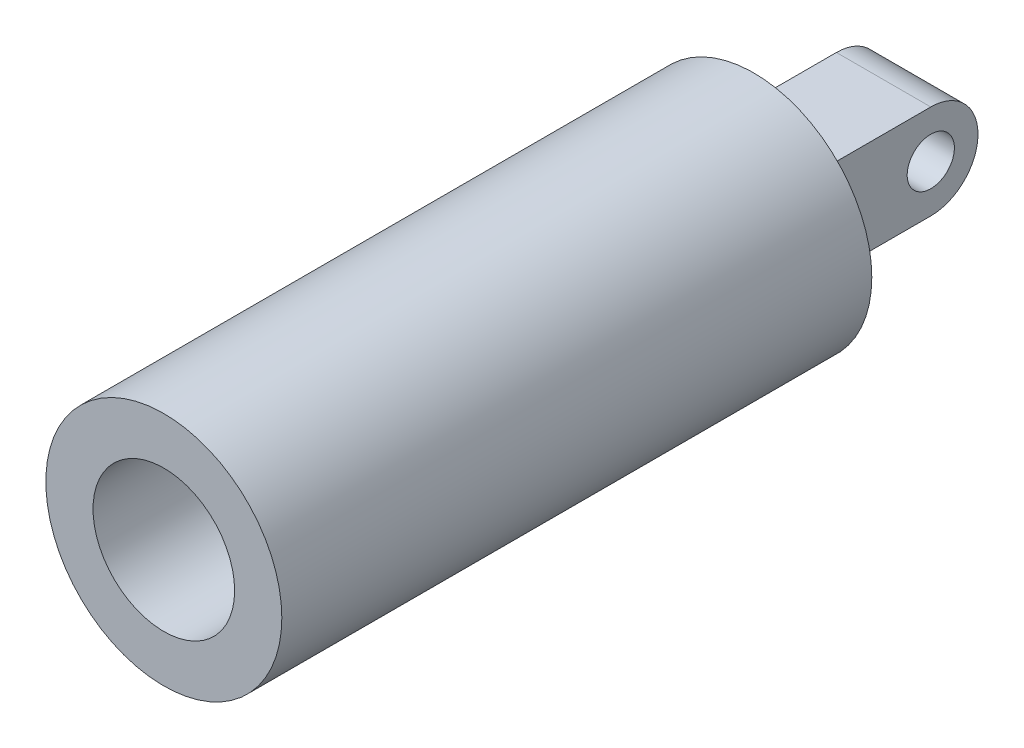
ISO-10303-21;
HEADER;
FILE_DESCRIPTION(('STEP AP214'),'2;1');
FILE_NAME('part.step','',(''),(''),'','','');
FILE_SCHEMA(('AUTOMOTIVE_DESIGN { 1 0 10303 214 1 1 1 1 }'));
ENDSEC;
DATA;
#1=APPLICATION_CONTEXT('core data for automotive mechanical design processes');
#2=APPLICATION_PROTOCOL_DEFINITION('international standard','automotive_design',2000,#1);
#3=PRODUCT_CONTEXT('',#1,'mechanical');
#4=PRODUCT('Part','Part','',(#3));
#5=PRODUCT_RELATED_PRODUCT_CATEGORY('part','',(#4));
#6=PRODUCT_DEFINITION_FORMATION('','',#4);
#7=PRODUCT_DEFINITION_CONTEXT('part definition',#1,'design');
#8=PRODUCT_DEFINITION('design','',#6,#7);
#9=PRODUCT_DEFINITION_SHAPE('','',#8);
#10=(LENGTH_UNIT() NAMED_UNIT(*) SI_UNIT(.MILLI.,.METRE.));
#11=(NAMED_UNIT(*) PLANE_ANGLE_UNIT() SI_UNIT($,.RADIAN.));
#12=(NAMED_UNIT(*) SI_UNIT($,.STERADIAN.) SOLID_ANGLE_UNIT());
#13=UNCERTAINTY_MEASURE_WITH_UNIT(LENGTH_MEASURE(1.E-05),#10,'distance_accuracy_value','');
#14=(GEOMETRIC_REPRESENTATION_CONTEXT(3) GLOBAL_UNCERTAINTY_ASSIGNED_CONTEXT((#13)) GLOBAL_UNIT_ASSIGNED_CONTEXT((#10,
#11,#12)) REPRESENTATION_CONTEXT('',''));
#15=CARTESIAN_POINT('',(0.,0.,0.));
#16=DIRECTION('',(0.,0.,1.));
#17=DIRECTION('',(1.,0.,0.));
#18=AXIS2_PLACEMENT_3D('',#15,#16,#17);
#19=CARTESIAN_POINT('',(0.,0.,0.));
#20=DIRECTION('',(0.,0.,1.));
#21=DIRECTION('',(1.,0.,0.));
#22=AXIS2_PLACEMENT_3D('',#19,#20,#21);
#23=PLANE('',#22);
#24=DIRECTION('',(1.,0.,0.));
#25=VECTOR('',#24,1.);
#26=CARTESIAN_POINT('',(-4.,5.,0.));
#27=LINE('',#26,#25);
#28=CARTESIAN_POINT('',(5.,5.,0.));
#29=VERTEX_POINT('',#28);
#30=CARTESIAN_POINT('',(-5.,5.,0.));
#31=VERTEX_POINT('',#30);
#32=EDGE_CURVE('E140',#29,#31,#27,.F.);
#33=ORIENTED_EDGE('',*,*,#32,.T.);
#34=DIRECTION('',(0.,1.,0.));
#35=VECTOR('',#34,1.);
#36=CARTESIAN_POINT('',(-5.,-4.,0.));
#37=LINE('',#36,#35);
#38=CARTESIAN_POINT('',(-5.,-5.,0.));
#39=VERTEX_POINT('',#38);
#40=EDGE_CURVE('E146',#31,#39,#37,.F.);
#41=ORIENTED_EDGE('',*,*,#40,.T.);
#42=DIRECTION('',(-1.,0.,0.));
#43=VECTOR('',#42,1.);
#44=CARTESIAN_POINT('',(4.,-5.,0.));
#45=LINE('',#44,#43);
#46=CARTESIAN_POINT('',(5.,-5.,0.));
#47=VERTEX_POINT('',#46);
#48=EDGE_CURVE('E144',#39,#47,#45,.F.);
#49=ORIENTED_EDGE('',*,*,#48,.T.);
#50=DIRECTION('',(0.,-1.,0.));
#51=VECTOR('',#50,1.);
#52=CARTESIAN_POINT('',(5.,4.,0.));
#53=LINE('',#52,#51);
#54=EDGE_CURVE('E142',#47,#29,#53,.F.);
#55=ORIENTED_EDGE('',*,*,#54,.T.);
#56=EDGE_LOOP('',(#33,#41,#49,#55));
#57=FACE_BOUND('',#56,.T.);
#58=CARTESIAN_POINT('',(0.,0.,0.));
#59=DIRECTION('',(0.,0.,1.));
#60=DIRECTION('',(1.,0.,0.));
#61=AXIS2_PLACEMENT_3D('',#58,#59,#60);
#62=CIRCLE('',#61,10.);
#63=CARTESIAN_POINT('',(10.,0.,0.));
#64=VERTEX_POINT('',#63);
#65=EDGE_CURVE('E128',#64,#64,#62,.T.);
#66=ORIENTED_EDGE('',*,*,#65,.F.);
#67=EDGE_LOOP('',(#66));
#68=FACE_BOUND('',#67,.T.);
#69=ADVANCED_FACE('F39',(#57,#68),#23,.F.);
#70=CARTESIAN_POINT('',(0.,0.,50.));
#71=DIRECTION('',(0.,0.,-1.));
#72=DIRECTION('',(-1.,0.,0.));
#73=AXIS2_PLACEMENT_3D('',#70,#71,#72);
#74=CYLINDRICAL_SURFACE('',#73,10.);
#75=CARTESIAN_POINT('',(0.,0.,50.));
#76=DIRECTION('',(0.,0.,1.));
#77=DIRECTION('',(1.,0.,0.));
#78=AXIS2_PLACEMENT_3D('',#75,#76,#77);
#79=CIRCLE('',#78,10.);
#80=CARTESIAN_POINT('',(10.,0.,50.));
#81=VERTEX_POINT('',#80);
#82=EDGE_CURVE('E123',#81,#81,#79,.T.);
#83=ORIENTED_EDGE('',*,*,#82,.F.);
#84=EDGE_LOOP('',(#83));
#85=FACE_BOUND('',#84,.T.);
#86=ORIENTED_EDGE('',*,*,#65,.T.);
#87=EDGE_LOOP('',(#86));
#88=FACE_BOUND('',#87,.T.);
#89=ADVANCED_FACE('F187',(#85,#88),#74,.T.);
#90=CARTESIAN_POINT('',(0.,0.,50.));
#91=DIRECTION('',(0.,0.,1.));
#92=DIRECTION('',(1.,0.,0.));
#93=AXIS2_PLACEMENT_3D('',#90,#91,#92);
#94=PLANE('',#93);
#95=CARTESIAN_POINT('',(0.,0.,50.));
#96=DIRECTION('',(0.,0.,1.));
#97=DIRECTION('',(1.,0.,0.));
#98=AXIS2_PLACEMENT_3D('',#95,#96,#97);
#99=CIRCLE('',#98,6.);
#100=CARTESIAN_POINT('',(6.,0.,50.));
#101=VERTEX_POINT('',#100);
#102=EDGE_CURVE('E116',#101,#101,#99,.T.);
#103=ORIENTED_EDGE('',*,*,#102,.F.);
#104=EDGE_LOOP('',(#103));
#105=FACE_BOUND('',#104,.T.);
#106=ORIENTED_EDGE('',*,*,#82,.T.);
#107=EDGE_LOOP('',(#106));
#108=FACE_BOUND('',#107,.T.);
#109=ADVANCED_FACE('F193',(#105,#108),#94,.T.);
#110=CARTESIAN_POINT('',(0.,0.,4.));
#111=DIRECTION('',(0.,0.,1.));
#112=DIRECTION('',(1.,0.,0.));
#113=AXIS2_PLACEMENT_3D('',#110,#111,#112);
#114=CYLINDRICAL_SURFACE('',#113,6.);
#115=CARTESIAN_POINT('',(0.,0.,4.));
#116=DIRECTION('',(0.,0.,1.));
#117=DIRECTION('',(1.,0.,0.));
#118=AXIS2_PLACEMENT_3D('',#115,#116,#117);
#119=CIRCLE('',#118,6.);
#120=CARTESIAN_POINT('',(6.,0.,4.));
#121=VERTEX_POINT('',#120);
#122=EDGE_CURVE('E239',#121,#121,#119,.T.);
#123=ORIENTED_EDGE('',*,*,#122,.F.);
#124=EDGE_LOOP('',(#123));
#125=FACE_BOUND('',#124,.T.);
#126=ORIENTED_EDGE('',*,*,#102,.T.);
#127=EDGE_LOOP('',(#126));
#128=FACE_BOUND('',#127,.T.);
#129=ADVANCED_FACE('F227',(#125,#128),#114,.F.);
#130=CARTESIAN_POINT('',(0.,0.,4.));
#131=DIRECTION('',(0.,0.,1.));
#132=DIRECTION('',(1.,0.,0.));
#133=AXIS2_PLACEMENT_3D('',#130,#131,#132);
#134=PLANE('',#133);
#135=ORIENTED_EDGE('',*,*,#122,.T.);
#136=EDGE_LOOP('',(#135));
#137=FACE_BOUND('',#136,.T.);
#138=ADVANCED_FACE('F224',(#137),#134,.T.);
#139=CARTESIAN_POINT('',(-4.,-4.,-15.));
#140=DIRECTION('',(1.,0.,0.));
#141=DIRECTION('',(0.,0.,-1.));
#142=AXIS2_PLACEMENT_3D('',#139,#140,#141);
#143=PLANE('',#142);
#144=CARTESIAN_POINT('',(-4.,0.,-11.));
#145=DIRECTION('',(1.,0.,0.));
#146=DIRECTION('',(0.,0.,-1.));
#147=AXIS2_PLACEMENT_3D('',#144,#145,#146);
#148=CIRCLE('',#147,2.);
#149=CARTESIAN_POINT('',(-4.,0.,-13.));
#150=VERTEX_POINT('',#149);
#151=EDGE_CURVE('E155',#150,#150,#148,.F.);
#152=ORIENTED_EDGE('',*,*,#151,.F.);
#153=EDGE_LOOP('',(#152));
#154=FACE_BOUND('',#153,.T.);
#155=DIRECTION('',(0.,0.,1.));
#156=VECTOR('',#155,1.);
#157=CARTESIAN_POINT('',(-4.,-4.,-15.));
#158=LINE('',#157,#156);
#159=CARTESIAN_POINT('',(-4.,-4.,-11.));
#160=VERTEX_POINT('',#159);
#161=CARTESIAN_POINT('',(-4.,-4.,-1.));
#162=VERTEX_POINT('',#161);
#163=EDGE_CURVE('E138',#160,#162,#158,.T.);
#164=ORIENTED_EDGE('',*,*,#163,.T.);
#165=DIRECTION('',(0.,1.,0.));
#166=VECTOR('',#165,1.);
#167=CARTESIAN_POINT('',(-4.,4.,-1.));
#168=LINE('',#167,#166);
#169=CARTESIAN_POINT('',(-4.,4.,-1.));
#170=VERTEX_POINT('',#169);
#171=EDGE_CURVE('E106',#162,#170,#168,.T.);
#172=ORIENTED_EDGE('',*,*,#171,.T.);
#173=DIRECTION('',(0.,0.,1.));
#174=VECTOR('',#173,1.);
#175=CARTESIAN_POINT('',(-4.,4.,-15.));
#176=LINE('',#175,#174);
#177=CARTESIAN_POINT('',(-4.,4.,-11.));
#178=VERTEX_POINT('',#177);
#179=EDGE_CURVE('E101',#178,#170,#176,.T.);
#180=ORIENTED_EDGE('',*,*,#179,.F.);
#181=CARTESIAN_POINT('',(-4.,0.,-11.));
#182=DIRECTION('',(1.,0.,0.));
#183=DIRECTION('',(0.,0.,-1.));
#184=AXIS2_PLACEMENT_3D('',#181,#182,#183);
#185=CIRCLE('',#184,4.);
#186=CARTESIAN_POINT('',(-4.,0.,-15.));
#187=VERTEX_POINT('',#186);
#188=EDGE_CURVE('E113',#178,#187,#185,.F.);
#189=ORIENTED_EDGE('',*,*,#188,.T.);
#190=CARTESIAN_POINT('',(-4.,0.,-11.));
#191=DIRECTION('',(1.,0.,0.));
#192=DIRECTION('',(0.,0.,-1.));
#193=AXIS2_PLACEMENT_3D('',#190,#191,#192);
#194=CIRCLE('',#193,4.);
#195=EDGE_CURVE('E122',#187,#160,#194,.F.);
#196=ORIENTED_EDGE('',*,*,#195,.T.);
#197=EDGE_LOOP('',(#164,#172,#180,#189,#196));
#198=FACE_BOUND('',#197,.T.);
#199=ADVANCED_FACE('F112',(#154,#198),#143,.F.);
#200=CARTESIAN_POINT('',(4.,4.,-15.));
#201=DIRECTION('',(0.,-1.,0.));
#202=DIRECTION('',(0.,0.,-1.));
#203=AXIS2_PLACEMENT_3D('',#200,#201,#202);
#204=PLANE('',#203);
#205=ORIENTED_EDGE('',*,*,#179,.T.);
#206=DIRECTION('',(1.,0.,0.));
#207=VECTOR('',#206,1.);
#208=CARTESIAN_POINT('',(4.,4.,-1.));
#209=LINE('',#208,#207);
#210=CARTESIAN_POINT('',(4.,4.,-1.));
#211=VERTEX_POINT('',#210);
#212=EDGE_CURVE('E11',#170,#211,#209,.T.);
#213=ORIENTED_EDGE('',*,*,#212,.T.);
#214=DIRECTION('',(0.,0.,1.));
#215=VECTOR('',#214,1.);
#216=CARTESIAN_POINT('',(4.,4.,-15.));
#217=LINE('',#216,#215);
#218=CARTESIAN_POINT('',(4.,4.,-11.));
#219=VERTEX_POINT('',#218);
#220=EDGE_CURVE('E102',#219,#211,#217,.T.);
#221=ORIENTED_EDGE('',*,*,#220,.F.);
#222=DIRECTION('',(1.,0.,0.));
#223=VECTOR('',#222,1.);
#224=CARTESIAN_POINT('',(4.,4.,-11.));
#225=LINE('',#224,#223);
#226=EDGE_CURVE('E98',#219,#178,#225,.F.);
#227=ORIENTED_EDGE('',*,*,#226,.T.);
#228=EDGE_LOOP('',(#205,#213,#221,#227));
#229=FACE_BOUND('',#228,.T.);
#230=ADVANCED_FACE('F100',(#229),#204,.F.);
#231=CARTESIAN_POINT('',(4.,-4.,-15.));
#232=DIRECTION('',(-1.,0.,0.));
#233=DIRECTION('',(0.,0.,1.));
#234=AXIS2_PLACEMENT_3D('',#231,#232,#233);
#235=PLANE('',#234);
#236=CARTESIAN_POINT('',(4.,0.,-11.));
#237=DIRECTION('',(1.,0.,0.));
#238=DIRECTION('',(0.,0.,-1.));
#239=AXIS2_PLACEMENT_3D('',#236,#237,#238);
#240=CIRCLE('',#239,2.);
#241=CARTESIAN_POINT('',(4.,0.,-13.));
#242=VERTEX_POINT('',#241);
#243=EDGE_CURVE('E251',#242,#242,#240,.T.);
#244=ORIENTED_EDGE('',*,*,#243,.F.);
#245=EDGE_LOOP('',(#244));
#246=FACE_BOUND('',#245,.T.);
#247=ORIENTED_EDGE('',*,*,#220,.T.);
#248=DIRECTION('',(0.,-1.,0.));
#249=VECTOR('',#248,1.);
#250=CARTESIAN_POINT('',(4.,-4.,-1.));
#251=LINE('',#250,#249);
#252=CARTESIAN_POINT('',(4.,-4.,-1.));
#253=VERTEX_POINT('',#252);
#254=EDGE_CURVE('E48',#211,#253,#251,.T.);
#255=ORIENTED_EDGE('',*,*,#254,.T.);
#256=DIRECTION('',(0.,0.,1.));
#257=VECTOR('',#256,1.);
#258=CARTESIAN_POINT('',(4.,-4.,-15.));
#259=LINE('',#258,#257);
#260=CARTESIAN_POINT('',(4.,-4.,-11.));
#261=VERTEX_POINT('',#260);
#262=EDGE_CURVE('E246',#261,#253,#259,.T.);
#263=ORIENTED_EDGE('',*,*,#262,.F.);
#264=CARTESIAN_POINT('',(4.,0.,-11.));
#265=DIRECTION('',(-1.,0.,0.));
#266=DIRECTION('',(0.,0.,1.));
#267=AXIS2_PLACEMENT_3D('',#264,#265,#266);
#268=CIRCLE('',#267,4.);
#269=CARTESIAN_POINT('',(4.,0.,-15.));
#270=VERTEX_POINT('',#269);
#271=EDGE_CURVE('E107',#261,#270,#268,.F.);
#272=ORIENTED_EDGE('',*,*,#271,.T.);
#273=CARTESIAN_POINT('',(4.,0.,-11.));
#274=DIRECTION('',(-1.,0.,0.));
#275=DIRECTION('',(0.,0.,1.));
#276=AXIS2_PLACEMENT_3D('',#273,#274,#275);
#277=CIRCLE('',#276,4.);
#278=EDGE_CURVE('E134',#270,#219,#277,.F.);
#279=ORIENTED_EDGE('',*,*,#278,.T.);
#280=EDGE_LOOP('',(#247,#255,#263,#272,#279));
#281=FACE_BOUND('',#280,.T.);
#282=ADVANCED_FACE('F209',(#246,#281),#235,.F.);
#283=CARTESIAN_POINT('',(4.,-4.,-15.));
#284=DIRECTION('',(0.,1.,0.));
#285=DIRECTION('',(0.,0.,1.));
#286=AXIS2_PLACEMENT_3D('',#283,#284,#285);
#287=PLANE('',#286);
#288=ORIENTED_EDGE('',*,*,#262,.T.);
#289=DIRECTION('',(-1.,0.,0.));
#290=VECTOR('',#289,1.);
#291=CARTESIAN_POINT('',(-4.,-4.,-1.));
#292=LINE('',#291,#290);
#293=EDGE_CURVE('E149',#253,#162,#292,.T.);
#294=ORIENTED_EDGE('',*,*,#293,.T.);
#295=ORIENTED_EDGE('',*,*,#163,.F.);
#296=DIRECTION('',(-1.,0.,0.));
#297=VECTOR('',#296,1.);
#298=CARTESIAN_POINT('',(4.,-4.,-11.));
#299=LINE('',#298,#297);
#300=EDGE_CURVE('E125',#160,#261,#299,.F.);
#301=ORIENTED_EDGE('',*,*,#300,.T.);
#302=EDGE_LOOP('',(#288,#294,#295,#301));
#303=FACE_BOUND('',#302,.T.);
#304=ADVANCED_FACE('F204',(#303),#287,.F.);
#305=CARTESIAN_POINT('',(0.,0.,-11.));
#306=DIRECTION('',(1.,0.,0.));
#307=DIRECTION('',(0.,0.,-1.));
#308=AXIS2_PLACEMENT_3D('',#305,#306,#307);
#309=CYLINDRICAL_SURFACE('',#308,4.);
#310=ORIENTED_EDGE('',*,*,#226,.F.);
#311=ORIENTED_EDGE('',*,*,#278,.F.);
#312=DIRECTION('',(1.,0.,0.));
#313=VECTOR('',#312,1.);
#314=CARTESIAN_POINT('',(0.,0.,-15.));
#315=LINE('',#314,#313);
#316=EDGE_CURVE('E120',#187,#270,#315,.T.);
#317=ORIENTED_EDGE('',*,*,#316,.F.);
#318=ORIENTED_EDGE('',*,*,#188,.F.);
#319=EDGE_LOOP('',(#310,#311,#317,#318));
#320=FACE_BOUND('',#319,.T.);
#321=ADVANCED_FACE('F118',(#320),#309,.T.);
#322=CARTESIAN_POINT('',(0.,0.,-11.));
#323=DIRECTION('',(-1.,0.,0.));
#324=DIRECTION('',(0.,0.,1.));
#325=AXIS2_PLACEMENT_3D('',#322,#323,#324);
#326=CYLINDRICAL_SURFACE('',#325,4.);
#327=ORIENTED_EDGE('',*,*,#271,.F.);
#328=ORIENTED_EDGE('',*,*,#300,.F.);
#329=ORIENTED_EDGE('',*,*,#195,.F.);
#330=ORIENTED_EDGE('',*,*,#316,.T.);
#331=EDGE_LOOP('',(#327,#328,#329,#330));
#332=FACE_BOUND('',#331,.T.);
#333=ADVANCED_FACE('F199',(#332),#326,.T.);
#334=CARTESIAN_POINT('',(5.,-4.,-1.));
#335=DIRECTION('',(0.,1.,0.));
#336=DIRECTION('',(0.,0.,1.));
#337=AXIS2_PLACEMENT_3D('',#334,#335,#336);
#338=CYLINDRICAL_SURFACE('',#337,1.);
#339=CARTESIAN_POINT('',(5.,5.,-1.));
#340=DIRECTION('',(-0.707106781186547,0.707106781186547,0.));
#341=DIRECTION('',(-0.707106781186547,-0.707106781186547,0.));
#342=AXIS2_PLACEMENT_3D('',#339,#340,#341);
#343=ELLIPSE('',#342,1.41421356237309,1.);
#344=EDGE_CURVE('E156',#29,#211,#343,.F.);
#345=ORIENTED_EDGE('',*,*,#344,.F.);
#346=ORIENTED_EDGE('',*,*,#54,.F.);
#347=CARTESIAN_POINT('',(5.,-5.,-1.));
#348=DIRECTION('',(0.707106781186547,0.707106781186547,0.));
#349=DIRECTION('',(-0.707106781186547,0.707106781186547,0.));
#350=AXIS2_PLACEMENT_3D('',#347,#348,#349);
#351=ELLIPSE('',#350,1.41421356237309,1.);
#352=EDGE_CURVE('E43',#253,#47,#351,.T.);
#353=ORIENTED_EDGE('',*,*,#352,.F.);
#354=ORIENTED_EDGE('',*,*,#254,.F.);
#355=EDGE_LOOP('',(#345,#346,#353,#354));
#356=FACE_BOUND('',#355,.T.);
#357=ADVANCED_FACE('F41',(#356),#338,.F.);
#358=CARTESIAN_POINT('',(4.,-5.,-1.));
#359=DIRECTION('',(1.,0.,0.));
#360=DIRECTION('',(0.,0.,-1.));
#361=AXIS2_PLACEMENT_3D('',#358,#359,#360);
#362=CYLINDRICAL_SURFACE('',#361,1.);
#363=ORIENTED_EDGE('',*,*,#352,.T.);
#364=ORIENTED_EDGE('',*,*,#48,.F.);
#365=CARTESIAN_POINT('',(-5.,-5.,-1.));
#366=DIRECTION('',(0.707106781186547,-0.707106781186547,0.));
#367=DIRECTION('',(0.707106781186547,0.707106781186547,0.));
#368=AXIS2_PLACEMENT_3D('',#365,#366,#367);
#369=ELLIPSE('',#368,1.41421356237309,1.);
#370=EDGE_CURVE('E154',#162,#39,#369,.T.);
#371=ORIENTED_EDGE('',*,*,#370,.F.);
#372=ORIENTED_EDGE('',*,*,#293,.F.);
#373=EDGE_LOOP('',(#363,#364,#371,#372));
#374=FACE_BOUND('',#373,.T.);
#375=ADVANCED_FACE('F166',(#374),#362,.F.);
#376=CARTESIAN_POINT('',(4.,5.,-1.));
#377=DIRECTION('',(-1.,0.,0.));
#378=DIRECTION('',(0.,0.,1.));
#379=AXIS2_PLACEMENT_3D('',#376,#377,#378);
#380=CYLINDRICAL_SURFACE('',#379,1.);
#381=ORIENTED_EDGE('',*,*,#344,.T.);
#382=ORIENTED_EDGE('',*,*,#212,.F.);
#383=CARTESIAN_POINT('',(-5.,5.,-1.));
#384=DIRECTION('',(-0.707106781186547,-0.707106781186547,0.));
#385=DIRECTION('',(-0.707106781186547,0.707106781186547,0.));
#386=AXIS2_PLACEMENT_3D('',#383,#384,#385);
#387=ELLIPSE('',#386,1.41421356237309,1.);
#388=EDGE_CURVE('E152',#31,#170,#387,.F.);
#389=ORIENTED_EDGE('',*,*,#388,.F.);
#390=ORIENTED_EDGE('',*,*,#32,.F.);
#391=EDGE_LOOP('',(#381,#382,#389,#390));
#392=FACE_BOUND('',#391,.T.);
#393=ADVANCED_FACE('F176',(#392),#380,.F.);
#394=CARTESIAN_POINT('',(-5.,-4.,-1.));
#395=DIRECTION('',(0.,-1.,0.));
#396=DIRECTION('',(0.,0.,-1.));
#397=AXIS2_PLACEMENT_3D('',#394,#395,#396);
#398=CYLINDRICAL_SURFACE('',#397,1.);
#399=ORIENTED_EDGE('',*,*,#370,.T.);
#400=ORIENTED_EDGE('',*,*,#40,.F.);
#401=ORIENTED_EDGE('',*,*,#388,.T.);
#402=ORIENTED_EDGE('',*,*,#171,.F.);
#403=EDGE_LOOP('',(#399,#400,#401,#402));
#404=FACE_BOUND('',#403,.T.);
#405=ADVANCED_FACE('F175',(#404),#398,.F.);
#406=CARTESIAN_POINT('',(-10.001,0.,-11.));
#407=DIRECTION('',(1.,0.,0.));
#408=DIRECTION('',(0.,0.,-1.));
#409=AXIS2_PLACEMENT_3D('',#406,#407,#408);
#410=CYLINDRICAL_SURFACE('',#409,2.);
#411=CARTESIAN_POINT('',(4.,0.,-13.));
#412=CARTESIAN_POINT('',(3.91666666666666,0.,-13.));
#413=CARTESIAN_POINT('',(3.83333333333333,0.,-13.));
#414=CARTESIAN_POINT('',(3.66666666666666,0.,-13.));
#415=CARTESIAN_POINT('',(3.58333333333333,0.,-13.));
#416=CARTESIAN_POINT('',(3.41666666666666,0.,-13.));
#417=CARTESIAN_POINT('',(3.33333333333333,0.,-13.));
#418=CARTESIAN_POINT('',(3.16666666666666,0.,-13.));
#419=CARTESIAN_POINT('',(3.08333333333333,0.,-13.));
#420=CARTESIAN_POINT('',(2.91666666666666,0.,-13.));
#421=CARTESIAN_POINT('',(2.83333333333333,0.,-13.));
#422=CARTESIAN_POINT('',(2.66666666666667,0.,-13.));
#423=CARTESIAN_POINT('',(2.58333333333333,0.,-13.));
#424=CARTESIAN_POINT('',(2.41666666666667,0.,-13.));
#425=CARTESIAN_POINT('',(2.33333333333333,0.,-13.));
#426=CARTESIAN_POINT('',(2.16666666666667,0.,-13.));
#427=CARTESIAN_POINT('',(2.08333333333333,0.,-13.));
#428=CARTESIAN_POINT('',(1.91666666666666,0.,-13.));
#429=CARTESIAN_POINT('',(1.83333333333333,0.,-13.));
#430=CARTESIAN_POINT('',(1.66666666666666,0.,-13.));
#431=CARTESIAN_POINT('',(1.58333333333333,0.,-13.));
#432=CARTESIAN_POINT('',(1.41666666666666,0.,-13.));
#433=CARTESIAN_POINT('',(1.33333333333333,0.,-13.));
#434=CARTESIAN_POINT('',(1.16666666666667,0.,-13.));
#435=CARTESIAN_POINT('',(1.08333333333333,0.,-13.));
#436=CARTESIAN_POINT('',(0.916666666666666,0.,-13.));
#437=CARTESIAN_POINT('',(0.833333333333332,0.,-13.));
#438=CARTESIAN_POINT('',(0.666666666666666,0.,-13.));
#439=CARTESIAN_POINT('',(0.583333333333332,0.,-13.));
#440=CARTESIAN_POINT('',(0.416666666666665,0.,-13.));
#441=CARTESIAN_POINT('',(0.333333333333332,0.,-13.));
#442=CARTESIAN_POINT('',(0.166666666666665,0.,-13.));
#443=CARTESIAN_POINT('',(0.0833333333333317,0.,-13.));
#444=CARTESIAN_POINT('',(-0.0833333333333351,0.,-13.));
#445=CARTESIAN_POINT('',(-0.166666666666669,0.,-13.));
#446=CARTESIAN_POINT('',(-0.333333333333335,0.,-13.));
#447=CARTESIAN_POINT('',(-0.416666666666669,0.,-13.));
#448=CARTESIAN_POINT('',(-0.583333333333336,0.,-13.));
#449=CARTESIAN_POINT('',(-0.666666666666669,0.,-13.));
#450=CARTESIAN_POINT('',(-0.833333333333336,0.,-13.));
#451=CARTESIAN_POINT('',(-0.916666666666669,0.,-13.));
#452=CARTESIAN_POINT('',(-1.08333333333334,0.,-13.));
#453=CARTESIAN_POINT('',(-1.16666666666667,0.,-13.));
#454=CARTESIAN_POINT('',(-1.33333333333334,0.,-13.));
#455=CARTESIAN_POINT('',(-1.41666666666667,0.,-13.));
#456=CARTESIAN_POINT('',(-1.58333333333333,0.,-13.));
#457=CARTESIAN_POINT('',(-1.66666666666667,0.,-13.));
#458=CARTESIAN_POINT('',(-1.83333333333334,0.,-13.));
#459=CARTESIAN_POINT('',(-1.91666666666667,0.,-13.));
#460=CARTESIAN_POINT('',(-2.08333333333334,0.,-13.));
#461=CARTESIAN_POINT('',(-2.16666666666667,0.,-13.));
#462=CARTESIAN_POINT('',(-2.33333333333333,0.,-13.));
#463=CARTESIAN_POINT('',(-2.41666666666667,0.,-13.));
#464=CARTESIAN_POINT('',(-2.58333333333333,0.,-13.));
#465=CARTESIAN_POINT('',(-2.66666666666667,0.,-13.));
#466=CARTESIAN_POINT('',(-2.83333333333333,0.,-13.));
#467=CARTESIAN_POINT('',(-2.91666666666667,0.,-13.));
#468=CARTESIAN_POINT('',(-3.08333333333333,0.,-13.));
#469=CARTESIAN_POINT('',(-3.16666666666667,0.,-13.));
#470=CARTESIAN_POINT('',(-3.33333333333333,0.,-13.));
#471=CARTESIAN_POINT('',(-3.41666666666667,0.,-13.));
#472=CARTESIAN_POINT('',(-3.58333333333333,0.,-13.));
#473=CARTESIAN_POINT('',(-3.66666666666667,0.,-13.));
#474=CARTESIAN_POINT('',(-3.83333333333333,0.,-13.));
#475=CARTESIAN_POINT('',(-3.91666666666667,0.,-13.));
#476=CARTESIAN_POINT('',(-4.,0.,-13.));
#477=B_SPLINE_CURVE_WITH_KNOTS('',3,(#411,#412,#413,#414,#415,#416,#417,#418,#419,#420,#421,
#422,#423,#424,#425,#426,#427,#428,#429,#430,#431,#432,#433,#434,#435,#436,#437,#438,#439,#440,
#441,#442,#443,#444,#445,#446,#447,#448,#449,#450,#451,#452,#453,#454,#455,#456,#457,#458,#459,
#460,#461,#462,#463,#464,#465,#466,#467,#468,#469,#470,#471,#472,#473,#474,#475,#476),
.UNSPECIFIED.,.F.,.F.,(4,2,2,2,2,2,2,2,2,2,2,2,2,2,2,2,2,2,2,2,2,2,2,2,2,2,2,2,2,2,2,2,4),(0.,
0.25,0.5,0.750000000000001,1.,1.25,1.5,1.75,2.,2.25,2.5,2.75,3.,3.25,3.5,3.75,4.,4.25,4.5,4.75,
5.,5.25,5.5,5.75,6.,6.25,6.5,6.75,7.,7.25,7.5,7.75,8.),.UNSPECIFIED.);
#478=EDGE_CURVE('BSEAM184',#242,#150,#477,.T.);
#479=ORIENTED_EDGE('',*,*,#243,.T.);
#480=ORIENTED_EDGE('',*,*,#151,.T.);
#481=ORIENTED_EDGE('',*,*,#478,.T.);
#482=ORIENTED_EDGE('',*,*,#478,.F.);
#483=EDGE_LOOP('',(#479,#481,#480,#482));
#484=FACE_BOUND('',#483,.T.);
#485=ADVANCED_FACE('F184',(#484),#410,.F.);
#486=CLOSED_SHELL('',(#69,#89,#109,#129,#138,#199,#230,#282,#304,#321,#333,#357,#375,#393,#405,#485));
#487=MANIFOLD_SOLID_BREP('B2',#486);
#488=ADVANCED_BREP_SHAPE_REPRESENTATION('',(#18,#487),#14);
#489=SHAPE_DEFINITION_REPRESENTATION(#9,#488);
ENDSEC;
END-ISO-10303-21;
